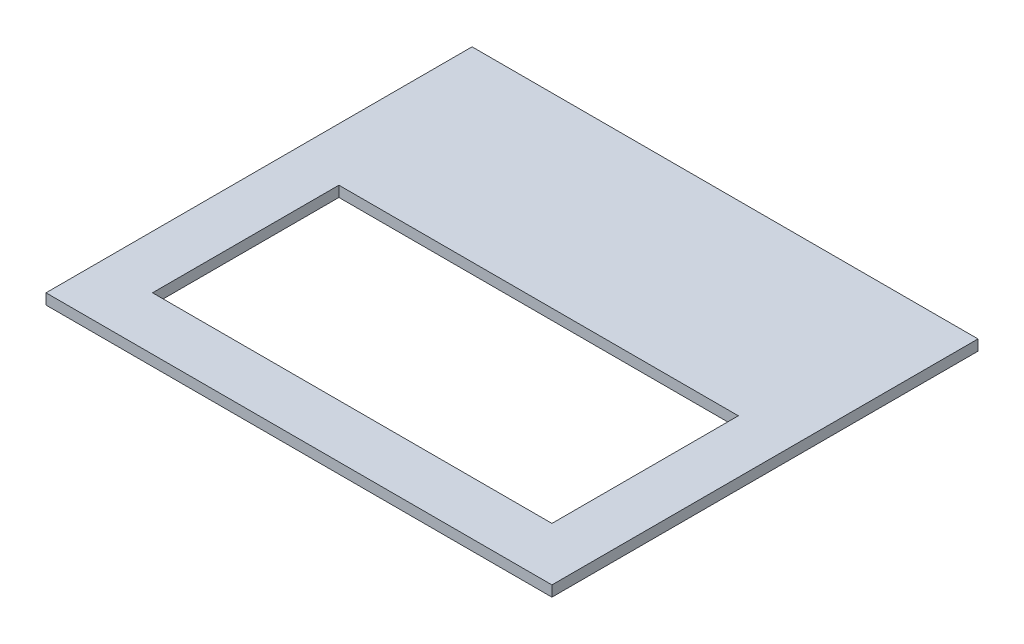
ISO-10303-21;
HEADER;
FILE_DESCRIPTION(('STEP AP214'),'2;1');
FILE_NAME('part.step','',(''),(''),'','','');
FILE_SCHEMA(('AUTOMOTIVE_DESIGN { 1 0 10303 214 1 1 1 1 }'));
ENDSEC;
DATA;
#1=APPLICATION_CONTEXT('core data for automotive mechanical design processes');
#2=APPLICATION_PROTOCOL_DEFINITION('international standard','automotive_design',2000,#1);
#3=PRODUCT_CONTEXT('',#1,'mechanical');
#4=PRODUCT('Part','Part','',(#3));
#5=PRODUCT_RELATED_PRODUCT_CATEGORY('part','',(#4));
#6=PRODUCT_DEFINITION_FORMATION('','',#4);
#7=PRODUCT_DEFINITION_CONTEXT('part definition',#1,'design');
#8=PRODUCT_DEFINITION('design','',#6,#7);
#9=PRODUCT_DEFINITION_SHAPE('','',#8);
#10=(LENGTH_UNIT() NAMED_UNIT(*) SI_UNIT(.MILLI.,.METRE.));
#11=(NAMED_UNIT(*) PLANE_ANGLE_UNIT() SI_UNIT($,.RADIAN.));
#12=(NAMED_UNIT(*) SI_UNIT($,.STERADIAN.) SOLID_ANGLE_UNIT());
#13=UNCERTAINTY_MEASURE_WITH_UNIT(LENGTH_MEASURE(1.E-05),#10,'distance_accuracy_value','');
#14=(GEOMETRIC_REPRESENTATION_CONTEXT(3) GLOBAL_UNCERTAINTY_ASSIGNED_CONTEXT((#13)) GLOBAL_UNIT_ASSIGNED_CONTEXT((#10,
#11,#12)) REPRESENTATION_CONTEXT('',''));
#15=CARTESIAN_POINT('',(0.,0.,0.));
#16=DIRECTION('',(0.,0.,1.));
#17=DIRECTION('',(1.,0.,0.));
#18=AXIS2_PLACEMENT_3D('',#15,#16,#17);
#19=CARTESIAN_POINT('',(0.,4.,0.));
#20=DIRECTION('',(0.,1.,0.));
#21=DIRECTION('',(0.,0.,1.));
#22=AXIS2_PLACEMENT_3D('',#19,#20,#21);
#23=PLANE('',#22);
#24=DIRECTION('',(0.,0.,1.));
#25=VECTOR('',#24,1.);
#26=CARTESIAN_POINT('',(-95.0000000000001,4.,-55.));
#27=LINE('',#26,#25);
#28=CARTESIAN_POINT('',(-95.0000000000001,4.,-105.));
#29=VERTEX_POINT('',#28);
#30=CARTESIAN_POINT('',(-95.0000000000001,4.,55.));
#31=VERTEX_POINT('',#30);
#32=EDGE_CURVE('E134',#29,#31,#27,.T.);
#33=ORIENTED_EDGE('',*,*,#32,.T.);
#34=DIRECTION('',(1.,0.,0.));
#35=VECTOR('',#34,1.);
#36=CARTESIAN_POINT('',(-95.0000000000001,4.,55.));
#37=LINE('',#36,#35);
#38=CARTESIAN_POINT('',(95.,4.,55.));
#39=VERTEX_POINT('',#38);
#40=EDGE_CURVE('E137',#31,#39,#37,.T.);
#41=ORIENTED_EDGE('',*,*,#40,.T.);
#42=DIRECTION('',(0.,0.,-1.));
#43=VECTOR('',#42,1.);
#44=CARTESIAN_POINT('',(95.,4.,-55.));
#45=LINE('',#44,#43);
#46=CARTESIAN_POINT('',(94.9999999999999,4.,-105.));
#47=VERTEX_POINT('',#46);
#48=EDGE_CURVE('E140',#39,#47,#45,.T.);
#49=ORIENTED_EDGE('',*,*,#48,.T.);
#50=DIRECTION('',(-1.,0.,0.));
#51=VECTOR('',#50,1.);
#52=CARTESIAN_POINT('',(-95.0000000000001,4.,-105.));
#53=LINE('',#52,#51);
#54=EDGE_CURVE('E142',#47,#29,#53,.T.);
#55=ORIENTED_EDGE('',*,*,#54,.T.);
#56=EDGE_LOOP('',(#33,#41,#49,#55));
#57=FACE_BOUND('',#56,.T.);
#58=DIRECTION('',(-1.,0.,0.));
#59=VECTOR('',#58,1.);
#60=CARTESIAN_POINT('',(-75.0000000000001,4.,-35.));
#61=LINE('',#60,#59);
#62=CARTESIAN_POINT('',(75.,4.,-35.));
#63=VERTEX_POINT('',#62);
#64=CARTESIAN_POINT('',(-75.0000000000001,4.,-35.));
#65=VERTEX_POINT('',#64);
#66=EDGE_CURVE('E106',#63,#65,#61,.T.);
#67=ORIENTED_EDGE('',*,*,#66,.F.);
#68=DIRECTION('',(0.,0.,-1.));
#69=VECTOR('',#68,1.);
#70=CARTESIAN_POINT('',(75.,4.,-35.));
#71=LINE('',#70,#69);
#72=CARTESIAN_POINT('',(74.9999999999999,4.,35.));
#73=VERTEX_POINT('',#72);
#74=EDGE_CURVE('E98',#73,#63,#71,.T.);
#75=ORIENTED_EDGE('',*,*,#74,.F.);
#76=DIRECTION('',(1.,0.,0.));
#77=VECTOR('',#76,1.);
#78=CARTESIAN_POINT('',(-75.0000000000001,4.,35.));
#79=LINE('',#78,#77);
#80=CARTESIAN_POINT('',(-75.0000000000001,4.,35.));
#81=VERTEX_POINT('',#80);
#82=EDGE_CURVE('E120',#81,#73,#79,.T.);
#83=ORIENTED_EDGE('',*,*,#82,.F.);
#84=DIRECTION('',(0.,0.,1.));
#85=VECTOR('',#84,1.);
#86=CARTESIAN_POINT('',(-75.0000000000001,4.,-35.));
#87=LINE('',#86,#85);
#88=EDGE_CURVE('E118',#65,#81,#87,.T.);
#89=ORIENTED_EDGE('',*,*,#88,.F.);
#90=EDGE_LOOP('',(#67,#75,#83,#89));
#91=FACE_BOUND('',#90,.T.);
#92=ADVANCED_FACE('F33',(#57,#91),#23,.T.);
#93=CARTESIAN_POINT('',(0.,0.,0.));
#94=DIRECTION('',(0.,1.,0.));
#95=DIRECTION('',(0.,0.,1.));
#96=AXIS2_PLACEMENT_3D('',#93,#94,#95);
#97=PLANE('',#96);
#98=DIRECTION('',(1.,0.,0.));
#99=VECTOR('',#98,1.);
#100=CARTESIAN_POINT('',(-95.0000000000001,0.,55.));
#101=LINE('',#100,#99);
#102=CARTESIAN_POINT('',(-95.0000000000001,0.,55.));
#103=VERTEX_POINT('',#102);
#104=CARTESIAN_POINT('',(95.,0.,55.));
#105=VERTEX_POINT('',#104);
#106=EDGE_CURVE('E114',#103,#105,#101,.T.);
#107=ORIENTED_EDGE('',*,*,#106,.F.);
#108=DIRECTION('',(0.,0.,1.));
#109=VECTOR('',#108,1.);
#110=CARTESIAN_POINT('',(-95.0000000000001,0.,-55.));
#111=LINE('',#110,#109);
#112=CARTESIAN_POINT('',(-95.0000000000001,0.,-105.));
#113=VERTEX_POINT('',#112);
#114=EDGE_CURVE('E138',#113,#103,#111,.T.);
#115=ORIENTED_EDGE('',*,*,#114,.F.);
#116=DIRECTION('',(-1.,0.,0.));
#117=VECTOR('',#116,1.);
#118=CARTESIAN_POINT('',(-95.0000000000001,0.,-105.));
#119=LINE('',#118,#117);
#120=CARTESIAN_POINT('',(94.9999999999999,0.,-105.));
#121=VERTEX_POINT('',#120);
#122=EDGE_CURVE('E150',#121,#113,#119,.T.);
#123=ORIENTED_EDGE('',*,*,#122,.F.);
#124=DIRECTION('',(0.,0.,-1.));
#125=VECTOR('',#124,1.);
#126=CARTESIAN_POINT('',(94.9999999999999,0.,-105.));
#127=LINE('',#126,#125);
#128=EDGE_CURVE('E148',#105,#121,#127,.T.);
#129=ORIENTED_EDGE('',*,*,#128,.F.);
#130=EDGE_LOOP('',(#107,#115,#123,#129));
#131=FACE_BOUND('',#130,.T.);
#132=DIRECTION('',(0.,0.,-1.));
#133=VECTOR('',#132,1.);
#134=CARTESIAN_POINT('',(75.,0.,-35.));
#135=LINE('',#134,#133);
#136=CARTESIAN_POINT('',(74.9999999999999,0.,35.));
#137=VERTEX_POINT('',#136);
#138=CARTESIAN_POINT('',(75.,0.,-35.));
#139=VERTEX_POINT('',#138);
#140=EDGE_CURVE('E56',#137,#139,#135,.T.);
#141=ORIENTED_EDGE('',*,*,#140,.T.);
#142=DIRECTION('',(-1.,0.,0.));
#143=VECTOR('',#142,1.);
#144=CARTESIAN_POINT('',(-75.0000000000001,0.,-35.));
#145=LINE('',#144,#143);
#146=CARTESIAN_POINT('',(-75.0000000000001,0.,-35.));
#147=VERTEX_POINT('',#146);
#148=EDGE_CURVE('E113',#139,#147,#145,.T.);
#149=ORIENTED_EDGE('',*,*,#148,.T.);
#150=DIRECTION('',(0.,0.,1.));
#151=VECTOR('',#150,1.);
#152=CARTESIAN_POINT('',(-75.0000000000001,0.,-35.));
#153=LINE('',#152,#151);
#154=CARTESIAN_POINT('',(-75.0000000000001,0.,35.));
#155=VERTEX_POINT('',#154);
#156=EDGE_CURVE('E126',#147,#155,#153,.T.);
#157=ORIENTED_EDGE('',*,*,#156,.T.);
#158=DIRECTION('',(1.,0.,0.));
#159=VECTOR('',#158,1.);
#160=CARTESIAN_POINT('',(-75.0000000000001,0.,35.));
#161=LINE('',#160,#159);
#162=EDGE_CURVE('E107',#155,#137,#161,.T.);
#163=ORIENTED_EDGE('',*,*,#162,.T.);
#164=EDGE_LOOP('',(#141,#149,#157,#163));
#165=FACE_BOUND('',#164,.T.);
#166=ADVANCED_FACE('F168',(#131,#165),#97,.F.);
#167=CARTESIAN_POINT('',(-95.0000000000001,4.,55.));
#168=DIRECTION('',(0.,0.,-1.));
#169=DIRECTION('',(-1.,0.,0.));
#170=AXIS2_PLACEMENT_3D('',#167,#168,#169);
#171=PLANE('',#170);
#172=ORIENTED_EDGE('',*,*,#106,.T.);
#173=DIRECTION('',(0.,-1.,0.));
#174=VECTOR('',#173,1.);
#175=CARTESIAN_POINT('',(95.,4.,55.));
#176=LINE('',#175,#174);
#177=EDGE_CURVE('E41',#39,#105,#176,.T.);
#178=ORIENTED_EDGE('',*,*,#177,.F.);
#179=ORIENTED_EDGE('',*,*,#40,.F.);
#180=DIRECTION('',(0.,-1.,0.));
#181=VECTOR('',#180,1.);
#182=CARTESIAN_POINT('',(-95.0000000000001,4.,55.));
#183=LINE('',#182,#181);
#184=EDGE_CURVE('E11',#31,#103,#183,.T.);
#185=ORIENTED_EDGE('',*,*,#184,.T.);
#186=EDGE_LOOP('',(#172,#178,#179,#185));
#187=FACE_BOUND('',#186,.T.);
#188=ADVANCED_FACE('F35',(#187),#171,.F.);
#189=CARTESIAN_POINT('',(94.9999999999999,4.,-105.));
#190=DIRECTION('',(-1.,0.,0.));
#191=DIRECTION('',(0.,0.,1.));
#192=AXIS2_PLACEMENT_3D('',#189,#190,#191);
#193=PLANE('',#192);
#194=ORIENTED_EDGE('',*,*,#128,.T.);
#195=DIRECTION('',(0.,-1.,0.));
#196=VECTOR('',#195,1.);
#197=CARTESIAN_POINT('',(94.9999999999999,4.,-105.));
#198=LINE('',#197,#196);
#199=EDGE_CURVE('E155',#47,#121,#198,.T.);
#200=ORIENTED_EDGE('',*,*,#199,.F.);
#201=ORIENTED_EDGE('',*,*,#48,.F.);
#202=ORIENTED_EDGE('',*,*,#177,.T.);
#203=EDGE_LOOP('',(#194,#200,#201,#202));
#204=FACE_BOUND('',#203,.T.);
#205=ADVANCED_FACE('F161',(#204),#193,.F.);
#206=CARTESIAN_POINT('',(-95.0000000000001,4.,-105.));
#207=DIRECTION('',(0.,0.,1.));
#208=DIRECTION('',(1.,0.,0.));
#209=AXIS2_PLACEMENT_3D('',#206,#207,#208);
#210=PLANE('',#209);
#211=ORIENTED_EDGE('',*,*,#122,.T.);
#212=DIRECTION('',(0.,-1.,0.));
#213=VECTOR('',#212,1.);
#214=CARTESIAN_POINT('',(-95.0000000000001,4.,-105.));
#215=LINE('',#214,#213);
#216=EDGE_CURVE('E145',#29,#113,#215,.T.);
#217=ORIENTED_EDGE('',*,*,#216,.F.);
#218=ORIENTED_EDGE('',*,*,#54,.F.);
#219=ORIENTED_EDGE('',*,*,#199,.T.);
#220=EDGE_LOOP('',(#211,#217,#218,#219));
#221=FACE_BOUND('',#220,.T.);
#222=ADVANCED_FACE('F173',(#221),#210,.F.);
#223=CARTESIAN_POINT('',(-95.0000000000001,4.,-55.));
#224=DIRECTION('',(1.,0.,0.));
#225=DIRECTION('',(0.,0.,-1.));
#226=AXIS2_PLACEMENT_3D('',#223,#224,#225);
#227=PLANE('',#226);
#228=ORIENTED_EDGE('',*,*,#114,.T.);
#229=ORIENTED_EDGE('',*,*,#184,.F.);
#230=ORIENTED_EDGE('',*,*,#32,.F.);
#231=ORIENTED_EDGE('',*,*,#216,.T.);
#232=EDGE_LOOP('',(#228,#229,#230,#231));
#233=FACE_BOUND('',#232,.T.);
#234=ADVANCED_FACE('F176',(#233),#227,.F.);
#235=CARTESIAN_POINT('',(75.,4.,-35.));
#236=DIRECTION('',(-1.,0.,0.));
#237=DIRECTION('',(0.,0.,1.));
#238=AXIS2_PLACEMENT_3D('',#235,#236,#237);
#239=PLANE('',#238);
#240=ORIENTED_EDGE('',*,*,#140,.F.);
#241=DIRECTION('',(0.,-1.,0.));
#242=VECTOR('',#241,1.);
#243=CARTESIAN_POINT('',(74.9999999999999,4.,35.));
#244=LINE('',#243,#242);
#245=EDGE_CURVE('E102',#73,#137,#244,.T.);
#246=ORIENTED_EDGE('',*,*,#245,.F.);
#247=ORIENTED_EDGE('',*,*,#74,.T.);
#248=DIRECTION('',(0.,-1.,0.));
#249=VECTOR('',#248,1.);
#250=CARTESIAN_POINT('',(75.,4.,-35.));
#251=LINE('',#250,#249);
#252=EDGE_CURVE('E101',#63,#139,#251,.T.);
#253=ORIENTED_EDGE('',*,*,#252,.T.);
#254=EDGE_LOOP('',(#240,#246,#247,#253));
#255=FACE_BOUND('',#254,.T.);
#256=ADVANCED_FACE('F100',(#255),#239,.T.);
#257=CARTESIAN_POINT('',(-75.0000000000001,4.,-35.));
#258=DIRECTION('',(0.,0.,1.));
#259=DIRECTION('',(1.,0.,0.));
#260=AXIS2_PLACEMENT_3D('',#257,#258,#259);
#261=PLANE('',#260);
#262=ORIENTED_EDGE('',*,*,#148,.F.);
#263=ORIENTED_EDGE('',*,*,#252,.F.);
#264=ORIENTED_EDGE('',*,*,#66,.T.);
#265=DIRECTION('',(0.,-1.,0.));
#266=VECTOR('',#265,1.);
#267=CARTESIAN_POINT('',(-75.0000000000001,4.,-35.));
#268=LINE('',#267,#266);
#269=EDGE_CURVE('E115',#65,#147,#268,.T.);
#270=ORIENTED_EDGE('',*,*,#269,.T.);
#271=EDGE_LOOP('',(#262,#263,#264,#270));
#272=FACE_BOUND('',#271,.T.);
#273=ADVANCED_FACE('F110',(#272),#261,.T.);
#274=CARTESIAN_POINT('',(-75.0000000000001,4.,-35.));
#275=DIRECTION('',(1.,0.,0.));
#276=DIRECTION('',(0.,0.,-1.));
#277=AXIS2_PLACEMENT_3D('',#274,#275,#276);
#278=PLANE('',#277);
#279=ORIENTED_EDGE('',*,*,#156,.F.);
#280=ORIENTED_EDGE('',*,*,#269,.F.);
#281=ORIENTED_EDGE('',*,*,#88,.T.);
#282=DIRECTION('',(0.,-1.,0.));
#283=VECTOR('',#282,1.);
#284=CARTESIAN_POINT('',(-75.0000000000001,4.,35.));
#285=LINE('',#284,#283);
#286=EDGE_CURVE('E48',#81,#155,#285,.T.);
#287=ORIENTED_EDGE('',*,*,#286,.T.);
#288=EDGE_LOOP('',(#279,#280,#281,#287));
#289=FACE_BOUND('',#288,.T.);
#290=ADVANCED_FACE('F242',(#289),#278,.T.);
#291=CARTESIAN_POINT('',(-75.0000000000001,4.,35.));
#292=DIRECTION('',(0.,0.,-1.));
#293=DIRECTION('',(-1.,0.,0.));
#294=AXIS2_PLACEMENT_3D('',#291,#292,#293);
#295=PLANE('',#294);
#296=ORIENTED_EDGE('',*,*,#162,.F.);
#297=ORIENTED_EDGE('',*,*,#286,.F.);
#298=ORIENTED_EDGE('',*,*,#82,.T.);
#299=ORIENTED_EDGE('',*,*,#245,.T.);
#300=EDGE_LOOP('',(#296,#297,#298,#299));
#301=FACE_BOUND('',#300,.T.);
#302=ADVANCED_FACE('F249',(#301),#295,.T.);
#303=CLOSED_SHELL('',(#92,#166,#188,#205,#222,#234,#256,#273,#290,#302));
#304=MANIFOLD_SOLID_BREP('B2',#303);
#305=ADVANCED_BREP_SHAPE_REPRESENTATION('',(#18,#304),#14);
#306=SHAPE_DEFINITION_REPRESENTATION(#9,#305);
ENDSEC;
END-ISO-10303-21;
